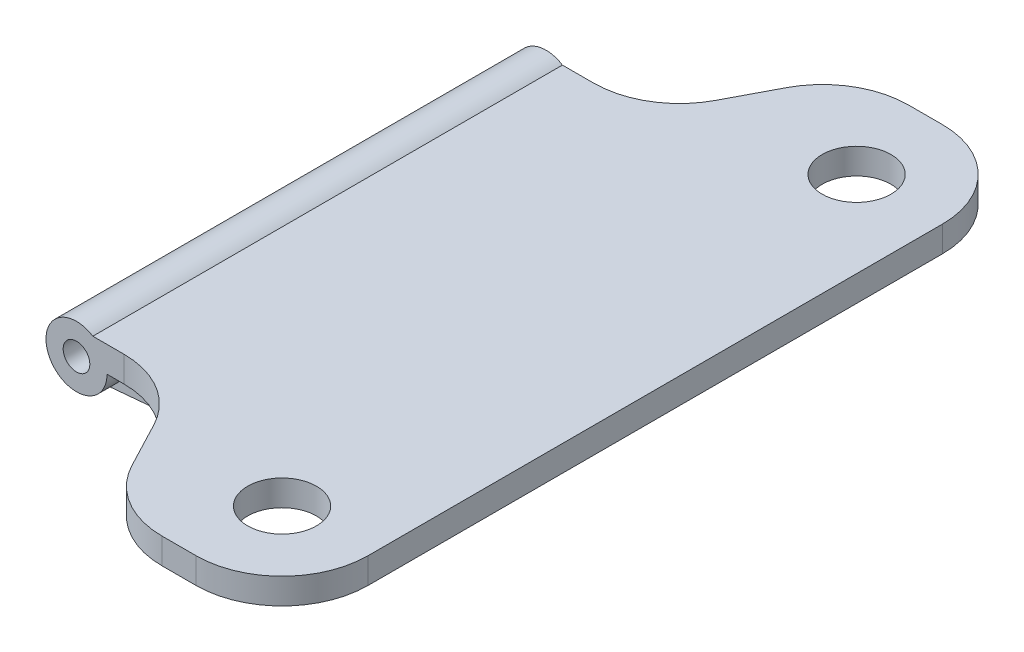
ISO-10303-21;
HEADER;
FILE_DESCRIPTION(('STEP AP214'),'2;1');
FILE_NAME('part.step','',(''),(''),'','','');
FILE_SCHEMA(('AUTOMOTIVE_DESIGN { 1 0 10303 214 1 1 1 1 }'));
ENDSEC;
DATA;
#1=APPLICATION_CONTEXT('core data for automotive mechanical design processes');
#2=APPLICATION_PROTOCOL_DEFINITION('international standard','automotive_design',2000,#1);
#3=PRODUCT_CONTEXT('',#1,'mechanical');
#4=PRODUCT('Part','Part','',(#3));
#5=PRODUCT_RELATED_PRODUCT_CATEGORY('part','',(#4));
#6=PRODUCT_DEFINITION_FORMATION('','',#4);
#7=PRODUCT_DEFINITION_CONTEXT('part definition',#1,'design');
#8=PRODUCT_DEFINITION('design','',#6,#7);
#9=PRODUCT_DEFINITION_SHAPE('','',#8);
#10=(LENGTH_UNIT() NAMED_UNIT(*) SI_UNIT(.MILLI.,.METRE.));
#11=(NAMED_UNIT(*) PLANE_ANGLE_UNIT() SI_UNIT($,.RADIAN.));
#12=(NAMED_UNIT(*) SI_UNIT($,.STERADIAN.) SOLID_ANGLE_UNIT());
#13=UNCERTAINTY_MEASURE_WITH_UNIT(LENGTH_MEASURE(1.E-05),#10,'distance_accuracy_value','');
#14=(GEOMETRIC_REPRESENTATION_CONTEXT(3) GLOBAL_UNCERTAINTY_ASSIGNED_CONTEXT((#13)) GLOBAL_UNIT_ASSIGNED_CONTEXT((#10,
#11,#12)) REPRESENTATION_CONTEXT('',''));
#15=CARTESIAN_POINT('',(0.,0.,0.));
#16=DIRECTION('',(0.,0.,1.));
#17=DIRECTION('',(1.,0.,0.));
#18=AXIS2_PLACEMENT_3D('',#15,#16,#17);
#19=CARTESIAN_POINT('',(38.1,0.,-42.418));
#20=DIRECTION('',(0.,-1.,0.));
#21=DIRECTION('',(0.,0.,-1.));
#22=AXIS2_PLACEMENT_3D('',#19,#20,#21);
#23=PLANE('',#22);
#24=CARTESIAN_POINT('',(38.1,0.,-42.418));
#25=DIRECTION('',(0.,1.,0.));
#26=DIRECTION('',(0.,0.,1.));
#27=AXIS2_PLACEMENT_3D('',#24,#25,#26);
#28=CIRCLE('',#27,5.08000000000001);
#29=CARTESIAN_POINT('',(38.1,0.,-37.338));
#30=VERTEX_POINT('',#29);
#31=EDGE_CURVE('E531',#30,#30,#28,.T.);
#32=ORIENTED_EDGE('',*,*,#31,.T.);
#33=EDGE_LOOP('',(#32));
#34=FACE_BOUND('',#33,.T.);
#35=DIRECTION('',(0.,0.,-1.));
#36=VECTOR('',#35,1.);
#37=CARTESIAN_POINT('',(50.8,0.,42.4179999999999));
#38=LINE('',#37,#36);
#39=CARTESIAN_POINT('',(50.8,0.,-31.75));
#40=VERTEX_POINT('',#39);
#41=CARTESIAN_POINT('',(50.8,0.,-42.4179999999999));
#42=VERTEX_POINT('',#41);
#43=EDGE_CURVE('E184',#40,#42,#38,.T.);
#44=ORIENTED_EDGE('',*,*,#43,.F.);
#45=DIRECTION('',(1.,0.,0.));
#46=VECTOR('',#45,1.);
#47=CARTESIAN_POINT('',(4.05605473335851,0.,-31.75));
#48=LINE('',#47,#46);
#49=CARTESIAN_POINT('',(4.5085,0.,-31.75));
#50=VERTEX_POINT('',#49);
#51=EDGE_CURVE('E545',#50,#40,#48,.T.);
#52=ORIENTED_EDGE('',*,*,#51,.F.);
#53=DIRECTION('',(0.,0.,1.));
#54=VECTOR('',#53,1.);
#55=CARTESIAN_POINT('',(4.5085,0.,-34.671));
#56=LINE('',#55,#54);
#57=CARTESIAN_POINT('',(4.5085,0.,-34.671));
#58=VERTEX_POINT('',#57);
#59=EDGE_CURVE('E228',#50,#58,#56,.F.);
#60=ORIENTED_EDGE('',*,*,#59,.T.);
#61=DIRECTION('',(-1.,0.,0.));
#62=VECTOR('',#61,1.);
#63=CARTESIAN_POINT('',(1.9685,0.,-34.671));
#64=LINE('',#63,#62);
#65=CARTESIAN_POINT('',(6.99111113202102,0.,-34.671));
#66=VERTEX_POINT('',#65);
#67=EDGE_CURVE('E464',#66,#58,#64,.T.);
#68=ORIENTED_EDGE('',*,*,#67,.F.);
#69=CARTESIAN_POINT('',(6.99111113202108,0.,-47.371));
#70=DIRECTION('',(0.,-1.,0.));
#71=DIRECTION('',(0.,0.,1.));
#72=AXIS2_PLACEMENT_3D('',#69,#70,#71);
#73=CIRCLE('',#72,12.7);
#74=CARTESIAN_POINT('',(18.2363830696182,0.,-41.4689783930003));
#75=VERTEX_POINT('',#74);
#76=EDGE_CURVE('E497',#75,#66,#73,.T.);
#77=ORIENTED_EDGE('',*,*,#76,.F.);
#78=DIRECTION('',(-0.464726110787379,0.,0.885454483275361));
#79=VECTOR('',#78,1.);
#80=CARTESIAN_POINT('',(18.2363830696182,0.,-41.4689783930003));
#81=LINE('',#80,#79);
#82=CARTESIAN_POINT('',(21.8321169303818,0.,-48.3200216069997));
#83=VERTEX_POINT('',#82);
#84=EDGE_CURVE('E495',#83,#75,#81,.T.);
#85=ORIENTED_EDGE('',*,*,#84,.F.);
#86=CARTESIAN_POINT('',(33.0773888679789,0.,-42.418));
#87=DIRECTION('',(0.,1.,0.));
#88=DIRECTION('',(0.,0.,-1.));
#89=AXIS2_PLACEMENT_3D('',#86,#87,#88);
#90=CIRCLE('',#89,12.7);
#91=CARTESIAN_POINT('',(33.077388867979,0.,-55.118));
#92=VERTEX_POINT('',#91);
#93=EDGE_CURVE('E493',#92,#83,#90,.T.);
#94=ORIENTED_EDGE('',*,*,#93,.F.);
#95=DIRECTION('',(-1.,0.,0.));
#96=VECTOR('',#95,1.);
#97=CARTESIAN_POINT('',(33.077388867979,0.,-55.118));
#98=LINE('',#97,#96);
#99=CARTESIAN_POINT('',(38.0999999999999,0.,-55.118));
#100=VERTEX_POINT('',#99);
#101=EDGE_CURVE('E490',#100,#92,#98,.T.);
#102=ORIENTED_EDGE('',*,*,#101,.F.);
#103=CARTESIAN_POINT('',(38.1,0.,-42.418));
#104=DIRECTION('',(0.,1.,0.));
#105=DIRECTION('',(0.,0.,-1.));
#106=AXIS2_PLACEMENT_3D('',#103,#104,#105);
#107=CIRCLE('',#106,12.7);
#108=EDGE_CURVE('E488',#42,#100,#107,.T.);
#109=ORIENTED_EDGE('',*,*,#108,.F.);
#110=EDGE_LOOP('',(#44,#52,#60,#68,#77,#85,#94,#102,#109));
#111=FACE_BOUND('',#110,.T.);
#112=ADVANCED_FACE('F32',(#34,#111),#23,.T.);
#113=CARTESIAN_POINT('',(0.,0.,-34.671));
#114=DIRECTION('',(0.,0.,1.));
#115=DIRECTION('',(1.,0.,0.));
#116=AXIS2_PLACEMENT_3D('',#113,#114,#115);
#117=CYLINDRICAL_SURFACE('',#116,4.5085);
#118=CARTESIAN_POINT('',(0.,0.,31.75));
#119=DIRECTION('',(0.,0.,1.));
#120=DIRECTION('',(1.,0.,0.));
#121=AXIS2_PLACEMENT_3D('',#118,#119,#120);
#122=CIRCLE('',#121,4.5085);
#123=CARTESIAN_POINT('',(4.5085,0.,31.75));
#124=VERTEX_POINT('',#123);
#125=CARTESIAN_POINT('',(0.794004722180393,-4.4380320809065,31.75));
#126=VERTEX_POINT('',#125);
#127=EDGE_CURVE('E166',#124,#126,#122,.F.);
#128=ORIENTED_EDGE('',*,*,#127,.F.);
#129=CARTESIAN_POINT('',(4.5085,0.,34.671));
#130=VERTEX_POINT('',#129);
#131=EDGE_CURVE('E176',#130,#124,#56,.F.);
#132=ORIENTED_EDGE('',*,*,#131,.F.);
#133=CARTESIAN_POINT('',(0.,0.,34.671));
#134=DIRECTION('',(0.,0.,1.));
#135=DIRECTION('',(1.,0.,0.));
#136=AXIS2_PLACEMENT_3D('',#133,#134,#135);
#137=CIRCLE('',#136,4.5085);
#138=CARTESIAN_POINT('',(2.41049211780499,3.81,34.671));
#139=VERTEX_POINT('',#138);
#140=EDGE_CURVE('E236',#139,#130,#137,.T.);
#141=ORIENTED_EDGE('',*,*,#140,.F.);
#142=DIRECTION('',(0.,0.,1.));
#143=VECTOR('',#142,1.);
#144=CARTESIAN_POINT('',(2.41049211780499,3.81,-34.671));
#145=LINE('',#144,#143);
#146=CARTESIAN_POINT('',(2.41049211780499,3.81,-34.671));
#147=VERTEX_POINT('',#146);
#148=EDGE_CURVE('E230',#139,#147,#145,.F.);
#149=ORIENTED_EDGE('',*,*,#148,.T.);
#150=CARTESIAN_POINT('',(0.,0.,-34.671));
#151=DIRECTION('',(0.,0.,1.));
#152=DIRECTION('',(1.,0.,0.));
#153=AXIS2_PLACEMENT_3D('',#150,#151,#152);
#154=CIRCLE('',#153,4.5085);
#155=EDGE_CURVE('E11',#147,#58,#154,.T.);
#156=ORIENTED_EDGE('',*,*,#155,.T.);
#157=ORIENTED_EDGE('',*,*,#59,.F.);
#158=CARTESIAN_POINT('',(0.,0.,-31.75));
#159=DIRECTION('',(0.,0.,1.));
#160=DIRECTION('',(1.,0.,0.));
#161=AXIS2_PLACEMENT_3D('',#158,#159,#160);
#162=CIRCLE('',#161,4.5085);
#163=CARTESIAN_POINT('',(0.794004722180393,-4.4380320809065,-31.75));
#164=VERTEX_POINT('',#163);
#165=EDGE_CURVE('E522',#50,#164,#162,.F.);
#166=ORIENTED_EDGE('',*,*,#165,.T.);
#167=DIRECTION('',(0.,0.,1.));
#168=VECTOR('',#167,1.);
#169=CARTESIAN_POINT('',(0.794004722180401,-4.43803208090649,-34.671));
#170=LINE('',#169,#168);
#171=EDGE_CURVE('E159',#126,#164,#170,.F.);
#172=ORIENTED_EDGE('',*,*,#171,.F.);
#173=EDGE_LOOP('',(#128,#132,#141,#149,#156,#157,#166,#172));
#174=FACE_BOUND('',#173,.T.);
#175=ADVANCED_FACE('F34',(#174),#117,.T.);
#176=CARTESIAN_POINT('',(0.,0.,-34.671));
#177=DIRECTION('',(0.,0.,1.));
#178=DIRECTION('',(1.,0.,0.));
#179=AXIS2_PLACEMENT_3D('',#176,#177,#178);
#180=PLANE('',#179);
#181=ORIENTED_EDGE('',*,*,#155,.F.);
#182=DIRECTION('',(-1.,0.,0.));
#183=VECTOR('',#182,1.);
#184=CARTESIAN_POINT('',(1.9685,3.81,-34.671));
#185=LINE('',#184,#183);
#186=CARTESIAN_POINT('',(6.99111113202102,3.81,-34.671));
#187=VERTEX_POINT('',#186);
#188=EDGE_CURVE('E462',#187,#147,#185,.T.);
#189=ORIENTED_EDGE('',*,*,#188,.F.);
#190=DIRECTION('',(0.,-1.,0.));
#191=VECTOR('',#190,1.);
#192=CARTESIAN_POINT('',(6.99111113202102,3.81,-34.671));
#193=LINE('',#192,#191);
#194=EDGE_CURVE('E213',#187,#66,#193,.T.);
#195=ORIENTED_EDGE('',*,*,#194,.T.);
#196=ORIENTED_EDGE('',*,*,#67,.T.);
#197=EDGE_LOOP('',(#181,#189,#195,#196));
#198=FACE_BOUND('',#197,.T.);
#199=CARTESIAN_POINT('',(0.,0.,-34.671));
#200=DIRECTION('',(0.,0.,1.));
#201=DIRECTION('',(1.,0.,0.));
#202=AXIS2_PLACEMENT_3D('',#199,#200,#201);
#203=CIRCLE('',#202,1.9685);
#204=CARTESIAN_POINT('',(1.9685,0.,-34.671));
#205=VERTEX_POINT('',#204);
#206=EDGE_CURVE('E40',#205,#205,#203,.T.);
#207=ORIENTED_EDGE('',*,*,#206,.T.);
#208=EDGE_LOOP('',(#207));
#209=FACE_BOUND('',#208,.T.);
#210=ADVANCED_FACE('F240',(#198,#209),#180,.F.);
#211=CARTESIAN_POINT('',(0.,0.,-34.671));
#212=DIRECTION('',(0.,0.,1.));
#213=DIRECTION('',(1.,0.,0.));
#214=AXIS2_PLACEMENT_3D('',#211,#212,#213);
#215=CYLINDRICAL_SURFACE('',#214,1.9685);
#216=ORIENTED_EDGE('',*,*,#206,.F.);
#217=EDGE_LOOP('',(#216));
#218=FACE_BOUND('',#217,.T.);
#219=CARTESIAN_POINT('',(0.,0.,34.671));
#220=DIRECTION('',(0.,0.,1.));
#221=DIRECTION('',(1.,0.,0.));
#222=AXIS2_PLACEMENT_3D('',#219,#220,#221);
#223=CIRCLE('',#222,1.9685);
#224=CARTESIAN_POINT('',(1.9685,0.,34.671));
#225=VERTEX_POINT('',#224);
#226=EDGE_CURVE('E233',#225,#225,#223,.T.);
#227=ORIENTED_EDGE('',*,*,#226,.T.);
#228=EDGE_LOOP('',(#227));
#229=FACE_BOUND('',#228,.T.);
#230=ADVANCED_FACE('F242',(#218,#229),#215,.F.);
#231=CARTESIAN_POINT('',(0.,0.,34.671));
#232=DIRECTION('',(0.,0.,1.));
#233=DIRECTION('',(1.,0.,0.));
#234=AXIS2_PLACEMENT_3D('',#231,#232,#233);
#235=PLANE('',#234);
#236=ORIENTED_EDGE('',*,*,#140,.T.);
#237=DIRECTION('',(1.,0.,0.));
#238=VECTOR('',#237,1.);
#239=CARTESIAN_POINT('',(1.9685,0.,34.671));
#240=LINE('',#239,#238);
#241=CARTESIAN_POINT('',(6.99111113202102,0.,34.671));
#242=VERTEX_POINT('',#241);
#243=EDGE_CURVE('E500',#130,#242,#240,.T.);
#244=ORIENTED_EDGE('',*,*,#243,.T.);
#245=DIRECTION('',(0.,-1.,0.));
#246=VECTOR('',#245,1.);
#247=CARTESIAN_POINT('',(6.99111113202102,3.81,34.671));
#248=LINE('',#247,#246);
#249=CARTESIAN_POINT('',(6.99111113202102,3.81,34.671));
#250=VERTEX_POINT('',#249);
#251=EDGE_CURVE('E210',#250,#242,#248,.T.);
#252=ORIENTED_EDGE('',*,*,#251,.F.);
#253=DIRECTION('',(1.,0.,0.));
#254=VECTOR('',#253,1.);
#255=CARTESIAN_POINT('',(1.9685,3.81,34.671));
#256=LINE('',#255,#254);
#257=EDGE_CURVE('E55',#139,#250,#256,.T.);
#258=ORIENTED_EDGE('',*,*,#257,.F.);
#259=EDGE_LOOP('',(#236,#244,#252,#258));
#260=FACE_BOUND('',#259,.T.);
#261=ORIENTED_EDGE('',*,*,#226,.F.);
#262=EDGE_LOOP('',(#261));
#263=FACE_BOUND('',#262,.T.);
#264=ADVANCED_FACE('F245',(#260,#263),#235,.T.);
#265=CARTESIAN_POINT('',(38.1,3.81,-42.418));
#266=DIRECTION('',(0.,-1.,0.));
#267=DIRECTION('',(0.,0.,-1.));
#268=AXIS2_PLACEMENT_3D('',#265,#266,#267);
#269=PLANE('',#268);
#270=ORIENTED_EDGE('',*,*,#148,.F.);
#271=ORIENTED_EDGE('',*,*,#257,.T.);
#272=CARTESIAN_POINT('',(6.99111113202108,3.81,47.371));
#273=DIRECTION('',(0.,-1.,0.));
#274=DIRECTION('',(0.,0.,-1.));
#275=AXIS2_PLACEMENT_3D('',#272,#273,#274);
#276=CIRCLE('',#275,12.7);
#277=CARTESIAN_POINT('',(18.2363830696182,3.81,41.4689783930003));
#278=VERTEX_POINT('',#277);
#279=EDGE_CURVE('E472',#250,#278,#276,.T.);
#280=ORIENTED_EDGE('',*,*,#279,.T.);
#281=DIRECTION('',(0.464726110787379,0.,0.885454483275361));
#282=VECTOR('',#281,1.);
#283=CARTESIAN_POINT('',(18.2363830696182,3.81,41.4689783930003));
#284=LINE('',#283,#282);
#285=CARTESIAN_POINT('',(21.8321169303818,3.81,48.3200216069997));
#286=VERTEX_POINT('',#285);
#287=EDGE_CURVE('E479',#278,#286,#284,.T.);
#288=ORIENTED_EDGE('',*,*,#287,.T.);
#289=CARTESIAN_POINT('',(33.0773888679789,3.81,42.418));
#290=DIRECTION('',(0.,1.,0.));
#291=DIRECTION('',(0.,0.,1.));
#292=AXIS2_PLACEMENT_3D('',#289,#290,#291);
#293=CIRCLE('',#292,12.7);
#294=CARTESIAN_POINT('',(33.0773888679789,3.81,55.118));
#295=VERTEX_POINT('',#294);
#296=EDGE_CURVE('E481',#286,#295,#293,.T.);
#297=ORIENTED_EDGE('',*,*,#296,.T.);
#298=DIRECTION('',(1.,0.,0.));
#299=VECTOR('',#298,1.);
#300=CARTESIAN_POINT('',(33.077388867979,3.81,55.118));
#301=LINE('',#300,#299);
#302=CARTESIAN_POINT('',(38.0999999999999,3.81,55.118));
#303=VERTEX_POINT('',#302);
#304=EDGE_CURVE('E483',#295,#303,#301,.T.);
#305=ORIENTED_EDGE('',*,*,#304,.T.);
#306=CARTESIAN_POINT('',(38.1,3.81,42.418));
#307=DIRECTION('',(0.,1.,0.));
#308=DIRECTION('',(0.,0.,1.));
#309=AXIS2_PLACEMENT_3D('',#306,#307,#308);
#310=CIRCLE('',#309,12.7);
#311=CARTESIAN_POINT('',(50.8,3.81,42.4179999999999));
#312=VERTEX_POINT('',#311);
#313=EDGE_CURVE('E485',#303,#312,#310,.T.);
#314=ORIENTED_EDGE('',*,*,#313,.T.);
#315=DIRECTION('',(0.,0.,-1.));
#316=VECTOR('',#315,1.);
#317=CARTESIAN_POINT('',(50.8,3.81,42.4179999999999));
#318=LINE('',#317,#316);
#319=CARTESIAN_POINT('',(50.8,3.81,-42.4179999999999));
#320=VERTEX_POINT('',#319);
#321=EDGE_CURVE('E196',#312,#320,#318,.T.);
#322=ORIENTED_EDGE('',*,*,#321,.T.);
#323=CARTESIAN_POINT('',(38.1,3.81,-42.418));
#324=DIRECTION('',(0.,1.,0.));
#325=DIRECTION('',(0.,0.,-1.));
#326=AXIS2_PLACEMENT_3D('',#323,#324,#325);
#327=CIRCLE('',#326,12.7);
#328=CARTESIAN_POINT('',(38.0999999999999,3.81,-55.118));
#329=VERTEX_POINT('',#328);
#330=EDGE_CURVE('E183',#320,#329,#327,.T.);
#331=ORIENTED_EDGE('',*,*,#330,.T.);
#332=DIRECTION('',(-1.,0.,0.));
#333=VECTOR('',#332,1.);
#334=CARTESIAN_POINT('',(33.077388867979,3.81,-55.118));
#335=LINE('',#334,#333);
#336=CARTESIAN_POINT('',(33.077388867979,3.81,-55.118));
#337=VERTEX_POINT('',#336);
#338=EDGE_CURVE('E187',#329,#337,#335,.T.);
#339=ORIENTED_EDGE('',*,*,#338,.T.);
#340=CARTESIAN_POINT('',(33.0773888679789,3.81,-42.418));
#341=DIRECTION('',(0.,1.,0.));
#342=DIRECTION('',(0.,0.,-1.));
#343=AXIS2_PLACEMENT_3D('',#340,#341,#342);
#344=CIRCLE('',#343,12.7);
#345=CARTESIAN_POINT('',(21.8321169303818,3.81,-48.3200216069997));
#346=VERTEX_POINT('',#345);
#347=EDGE_CURVE('E536',#337,#346,#344,.T.);
#348=ORIENTED_EDGE('',*,*,#347,.T.);
#349=DIRECTION('',(-0.464726110787379,0.,0.885454483275361));
#350=VECTOR('',#349,1.);
#351=CARTESIAN_POINT('',(18.2363830696182,3.81,-41.4689783930003));
#352=LINE('',#351,#350);
#353=CARTESIAN_POINT('',(18.2363830696182,3.81,-41.4689783930003));
#354=VERTEX_POINT('',#353);
#355=EDGE_CURVE('E474',#346,#354,#352,.T.);
#356=ORIENTED_EDGE('',*,*,#355,.T.);
#357=CARTESIAN_POINT('',(6.99111113202108,3.81,-47.371));
#358=DIRECTION('',(0.,-1.,0.));
#359=DIRECTION('',(0.,0.,1.));
#360=AXIS2_PLACEMENT_3D('',#357,#358,#359);
#361=CIRCLE('',#360,12.7);
#362=EDGE_CURVE('E469',#354,#187,#361,.T.);
#363=ORIENTED_EDGE('',*,*,#362,.T.);
#364=ORIENTED_EDGE('',*,*,#188,.T.);
#365=EDGE_LOOP('',(#270,#271,#280,#288,#297,#305,#314,#322,#331,#339,#348,#356,#363,#364));
#366=FACE_BOUND('',#365,.T.);
#367=CARTESIAN_POINT('',(38.1,3.81,-42.418));
#368=DIRECTION('',(0.,1.,0.));
#369=DIRECTION('',(0.,0.,1.));
#370=AXIS2_PLACEMENT_3D('',#367,#368,#369);
#371=CIRCLE('',#370,5.08000000000001);
#372=CARTESIAN_POINT('',(38.1,3.81,-37.338));
#373=VERTEX_POINT('',#372);
#374=EDGE_CURVE('E491',#373,#373,#371,.T.);
#375=ORIENTED_EDGE('',*,*,#374,.F.);
#376=EDGE_LOOP('',(#375));
#377=FACE_BOUND('',#376,.T.);
#378=CARTESIAN_POINT('',(38.1,3.81,42.418));
#379=DIRECTION('',(0.,1.,0.));
#380=DIRECTION('',(0.,0.,1.));
#381=AXIS2_PLACEMENT_3D('',#378,#379,#380);
#382=CIRCLE('',#381,5.08000000000001);
#383=CARTESIAN_POINT('',(38.1,3.81,47.498));
#384=VERTEX_POINT('',#383);
#385=EDGE_CURVE('E525',#384,#384,#382,.T.);
#386=ORIENTED_EDGE('',*,*,#385,.F.);
#387=EDGE_LOOP('',(#386));
#388=FACE_BOUND('',#387,.T.);
#389=ADVANCED_FACE('F250',(#366,#377,#388),#269,.F.);
#390=DIRECTION('',(1.,0.,0.));
#391=VECTOR('',#390,1.);
#392=CARTESIAN_POINT('',(4.05605473335851,0.,31.75));
#393=LINE('',#392,#391);
#394=CARTESIAN_POINT('',(50.8,0.,31.75));
#395=VERTEX_POINT('',#394);
#396=EDGE_CURVE('E164',#124,#395,#393,.T.);
#397=ORIENTED_EDGE('',*,*,#396,.T.);
#398=CARTESIAN_POINT('',(50.8,0.,42.4179999999999));
#399=VERTEX_POINT('',#398);
#400=EDGE_CURVE('E174',#399,#395,#38,.T.);
#401=ORIENTED_EDGE('',*,*,#400,.F.);
#402=CARTESIAN_POINT('',(38.1,0.,42.418));
#403=DIRECTION('',(0.,1.,0.));
#404=DIRECTION('',(0.,0.,1.));
#405=AXIS2_PLACEMENT_3D('',#402,#403,#404);
#406=CIRCLE('',#405,12.7);
#407=CARTESIAN_POINT('',(38.0999999999999,0.,55.118));
#408=VERTEX_POINT('',#407);
#409=EDGE_CURVE('E189',#408,#399,#406,.T.);
#410=ORIENTED_EDGE('',*,*,#409,.F.);
#411=DIRECTION('',(1.,0.,0.));
#412=VECTOR('',#411,1.);
#413=CARTESIAN_POINT('',(33.077388867979,0.,55.118));
#414=LINE('',#413,#412);
#415=CARTESIAN_POINT('',(33.0773888679789,0.,55.118));
#416=VERTEX_POINT('',#415);
#417=EDGE_CURVE('E507',#416,#408,#414,.T.);
#418=ORIENTED_EDGE('',*,*,#417,.F.);
#419=CARTESIAN_POINT('',(33.0773888679789,0.,42.418));
#420=DIRECTION('',(0.,1.,0.));
#421=DIRECTION('',(0.,0.,1.));
#422=AXIS2_PLACEMENT_3D('',#419,#420,#421);
#423=CIRCLE('',#422,12.7);
#424=CARTESIAN_POINT('',(21.8321169303818,0.,48.3200216069997));
#425=VERTEX_POINT('',#424);
#426=EDGE_CURVE('E506',#425,#416,#423,.T.);
#427=ORIENTED_EDGE('',*,*,#426,.F.);
#428=DIRECTION('',(0.464726110787379,0.,0.885454483275361));
#429=VECTOR('',#428,1.);
#430=CARTESIAN_POINT('',(18.2363830696182,0.,41.4689783930003));
#431=LINE('',#430,#429);
#432=CARTESIAN_POINT('',(18.2363830696182,0.,41.4689783930003));
#433=VERTEX_POINT('',#432);
#434=EDGE_CURVE('E504',#433,#425,#431,.T.);
#435=ORIENTED_EDGE('',*,*,#434,.F.);
#436=CARTESIAN_POINT('',(6.99111113202108,0.,47.371));
#437=DIRECTION('',(0.,-1.,0.));
#438=DIRECTION('',(0.,0.,-1.));
#439=AXIS2_PLACEMENT_3D('',#436,#437,#438);
#440=CIRCLE('',#439,12.7);
#441=EDGE_CURVE('E502',#242,#433,#440,.T.);
#442=ORIENTED_EDGE('',*,*,#441,.F.);
#443=ORIENTED_EDGE('',*,*,#243,.F.);
#444=ORIENTED_EDGE('',*,*,#131,.T.);
#445=EDGE_LOOP('',(#397,#401,#410,#418,#427,#435,#442,#443,#444));
#446=FACE_BOUND('',#445,.T.);
#447=CARTESIAN_POINT('',(38.1,0.,42.418));
#448=DIRECTION('',(0.,1.,0.));
#449=DIRECTION('',(0.,0.,1.));
#450=AXIS2_PLACEMENT_3D('',#447,#448,#449);
#451=CIRCLE('',#450,5.08000000000001);
#452=CARTESIAN_POINT('',(38.1,0.,47.498));
#453=VERTEX_POINT('',#452);
#454=EDGE_CURVE('E521',#453,#453,#451,.T.);
#455=ORIENTED_EDGE('',*,*,#454,.T.);
#456=EDGE_LOOP('',(#455));
#457=FACE_BOUND('',#456,.T.);
#458=ADVANCED_FACE('F171',(#446,#457),#23,.T.);
#459=CARTESIAN_POINT('',(38.1,3.81,-42.418));
#460=DIRECTION('',(0.,-1.,0.));
#461=DIRECTION('',(0.,0.,-1.));
#462=AXIS2_PLACEMENT_3D('',#459,#460,#461);
#463=CYLINDRICAL_SURFACE('',#462,12.7);
#464=ORIENTED_EDGE('',*,*,#108,.T.);
#465=DIRECTION('',(0.,-1.,0.));
#466=VECTOR('',#465,1.);
#467=CARTESIAN_POINT('',(38.0999999999999,3.81,-55.118));
#468=LINE('',#467,#466);
#469=EDGE_CURVE('E225',#329,#100,#468,.T.);
#470=ORIENTED_EDGE('',*,*,#469,.F.);
#471=ORIENTED_EDGE('',*,*,#330,.F.);
#472=DIRECTION('',(0.,-1.,0.));
#473=VECTOR('',#472,1.);
#474=CARTESIAN_POINT('',(50.8,3.81,-42.4179999999999));
#475=LINE('',#474,#473);
#476=EDGE_CURVE('E193',#320,#42,#475,.T.);
#477=ORIENTED_EDGE('',*,*,#476,.T.);
#478=EDGE_LOOP('',(#464,#470,#471,#477));
#479=FACE_BOUND('',#478,.T.);
#480=ADVANCED_FACE('F269',(#479),#463,.T.);
#481=CARTESIAN_POINT('',(33.077388867979,3.81,-55.118));
#482=DIRECTION('',(0.,0.,1.));
#483=DIRECTION('',(1.,0.,0.));
#484=AXIS2_PLACEMENT_3D('',#481,#482,#483);
#485=PLANE('',#484);
#486=ORIENTED_EDGE('',*,*,#101,.T.);
#487=DIRECTION('',(0.,-1.,0.));
#488=VECTOR('',#487,1.);
#489=CARTESIAN_POINT('',(33.077388867979,3.81,-55.118));
#490=LINE('',#489,#488);
#491=EDGE_CURVE('E222',#337,#92,#490,.T.);
#492=ORIENTED_EDGE('',*,*,#491,.F.);
#493=ORIENTED_EDGE('',*,*,#338,.F.);
#494=ORIENTED_EDGE('',*,*,#469,.T.);
#495=EDGE_LOOP('',(#486,#492,#493,#494));
#496=FACE_BOUND('',#495,.T.);
#497=ADVANCED_FACE('F273',(#496),#485,.F.);
#498=CARTESIAN_POINT('',(33.0773888679789,3.81,-42.418));
#499=DIRECTION('',(0.,-1.,0.));
#500=DIRECTION('',(0.,0.,-1.));
#501=AXIS2_PLACEMENT_3D('',#498,#499,#500);
#502=CYLINDRICAL_SURFACE('',#501,12.7);
#503=ORIENTED_EDGE('',*,*,#93,.T.);
#504=DIRECTION('',(0.,-1.,0.));
#505=VECTOR('',#504,1.);
#506=CARTESIAN_POINT('',(21.8321169303818,3.81,-48.3200216069997));
#507=LINE('',#506,#505);
#508=EDGE_CURVE('E219',#346,#83,#507,.T.);
#509=ORIENTED_EDGE('',*,*,#508,.F.);
#510=ORIENTED_EDGE('',*,*,#347,.F.);
#511=ORIENTED_EDGE('',*,*,#491,.T.);
#512=EDGE_LOOP('',(#503,#509,#510,#511));
#513=FACE_BOUND('',#512,.T.);
#514=ADVANCED_FACE('F278',(#513),#502,.T.);
#515=CARTESIAN_POINT('',(18.2363830696182,3.81,-41.4689783930003));
#516=DIRECTION('',(0.885454483275361,0.,0.464726110787379));
#517=DIRECTION('',(0.464726110787379,0.,-0.885454483275361));
#518=AXIS2_PLACEMENT_3D('',#515,#516,#517);
#519=PLANE('',#518);
#520=ORIENTED_EDGE('',*,*,#84,.T.);
#521=DIRECTION('',(0.,-1.,0.));
#522=VECTOR('',#521,1.);
#523=CARTESIAN_POINT('',(18.2363830696182,3.81,-41.4689783930003));
#524=LINE('',#523,#522);
#525=EDGE_CURVE('E216',#354,#75,#524,.T.);
#526=ORIENTED_EDGE('',*,*,#525,.F.);
#527=ORIENTED_EDGE('',*,*,#355,.F.);
#528=ORIENTED_EDGE('',*,*,#508,.T.);
#529=EDGE_LOOP('',(#520,#526,#527,#528));
#530=FACE_BOUND('',#529,.T.);
#531=ADVANCED_FACE('F285',(#530),#519,.F.);
#532=CARTESIAN_POINT('',(6.99111113202108,3.81,-47.371));
#533=DIRECTION('',(0.,-1.,0.));
#534=DIRECTION('',(0.,0.,-1.));
#535=AXIS2_PLACEMENT_3D('',#532,#533,#534);
#536=CYLINDRICAL_SURFACE('',#535,12.7);
#537=ORIENTED_EDGE('',*,*,#76,.T.);
#538=ORIENTED_EDGE('',*,*,#194,.F.);
#539=ORIENTED_EDGE('',*,*,#362,.F.);
#540=ORIENTED_EDGE('',*,*,#525,.T.);
#541=EDGE_LOOP('',(#537,#538,#539,#540));
#542=FACE_BOUND('',#541,.T.);
#543=ADVANCED_FACE('F289',(#542),#536,.F.);
#544=CARTESIAN_POINT('',(6.99111113202108,3.81,47.371));
#545=DIRECTION('',(0.,-1.,0.));
#546=DIRECTION('',(0.,0.,-1.));
#547=AXIS2_PLACEMENT_3D('',#544,#545,#546);
#548=CYLINDRICAL_SURFACE('',#547,12.7);
#549=ORIENTED_EDGE('',*,*,#441,.T.);
#550=DIRECTION('',(0.,-1.,0.));
#551=VECTOR('',#550,1.);
#552=CARTESIAN_POINT('',(18.2363830696182,3.81,41.4689783930003));
#553=LINE('',#552,#551);
#554=EDGE_CURVE('E207',#278,#433,#553,.T.);
#555=ORIENTED_EDGE('',*,*,#554,.F.);
#556=ORIENTED_EDGE('',*,*,#279,.F.);
#557=ORIENTED_EDGE('',*,*,#251,.T.);
#558=EDGE_LOOP('',(#549,#555,#556,#557));
#559=FACE_BOUND('',#558,.T.);
#560=ADVANCED_FACE('F293',(#559),#548,.F.);
#561=CARTESIAN_POINT('',(18.2363830696182,3.81,41.4689783930003));
#562=DIRECTION('',(0.885454483275361,0.,-0.464726110787379));
#563=DIRECTION('',(-0.464726110787379,0.,-0.885454483275361));
#564=AXIS2_PLACEMENT_3D('',#561,#562,#563);
#565=PLANE('',#564);
#566=ORIENTED_EDGE('',*,*,#434,.T.);
#567=DIRECTION('',(0.,-1.,0.));
#568=VECTOR('',#567,1.);
#569=CARTESIAN_POINT('',(21.8321169303818,3.81,48.3200216069997));
#570=LINE('',#569,#568);
#571=EDGE_CURVE('E204',#286,#425,#570,.T.);
#572=ORIENTED_EDGE('',*,*,#571,.F.);
#573=ORIENTED_EDGE('',*,*,#287,.F.);
#574=ORIENTED_EDGE('',*,*,#554,.T.);
#575=EDGE_LOOP('',(#566,#572,#573,#574));
#576=FACE_BOUND('',#575,.T.);
#577=ADVANCED_FACE('F297',(#576),#565,.F.);
#578=CARTESIAN_POINT('',(33.0773888679789,3.81,42.418));
#579=DIRECTION('',(0.,-1.,0.));
#580=DIRECTION('',(0.,0.,-1.));
#581=AXIS2_PLACEMENT_3D('',#578,#579,#580);
#582=CYLINDRICAL_SURFACE('',#581,12.7);
#583=ORIENTED_EDGE('',*,*,#426,.T.);
#584=DIRECTION('',(0.,-1.,0.));
#585=VECTOR('',#584,1.);
#586=CARTESIAN_POINT('',(33.0773888679789,3.81,55.118));
#587=LINE('',#586,#585);
#588=EDGE_CURVE('E201',#295,#416,#587,.T.);
#589=ORIENTED_EDGE('',*,*,#588,.F.);
#590=ORIENTED_EDGE('',*,*,#296,.F.);
#591=ORIENTED_EDGE('',*,*,#571,.T.);
#592=EDGE_LOOP('',(#583,#589,#590,#591));
#593=FACE_BOUND('',#592,.T.);
#594=ADVANCED_FACE('F301',(#593),#582,.T.);
#595=CARTESIAN_POINT('',(33.077388867979,3.81,55.118));
#596=DIRECTION('',(0.,0.,-1.));
#597=DIRECTION('',(-1.,0.,0.));
#598=AXIS2_PLACEMENT_3D('',#595,#596,#597);
#599=PLANE('',#598);
#600=ORIENTED_EDGE('',*,*,#417,.T.);
#601=DIRECTION('',(0.,-1.,0.));
#602=VECTOR('',#601,1.);
#603=CARTESIAN_POINT('',(38.0999999999999,3.81,55.118));
#604=LINE('',#603,#602);
#605=EDGE_CURVE('E198',#303,#408,#604,.T.);
#606=ORIENTED_EDGE('',*,*,#605,.F.);
#607=ORIENTED_EDGE('',*,*,#304,.F.);
#608=ORIENTED_EDGE('',*,*,#588,.T.);
#609=EDGE_LOOP('',(#600,#606,#607,#608));
#610=FACE_BOUND('',#609,.T.);
#611=ADVANCED_FACE('F305',(#610),#599,.F.);
#612=CARTESIAN_POINT('',(38.1,3.81,42.418));
#613=DIRECTION('',(0.,-1.,0.));
#614=DIRECTION('',(0.,0.,-1.));
#615=AXIS2_PLACEMENT_3D('',#612,#613,#614);
#616=CYLINDRICAL_SURFACE('',#615,12.7);
#617=ORIENTED_EDGE('',*,*,#409,.T.);
#618=DIRECTION('',(0.,-1.,0.));
#619=VECTOR('',#618,1.);
#620=CARTESIAN_POINT('',(50.8,3.81,42.4179999999999));
#621=LINE('',#620,#619);
#622=EDGE_CURVE('E182',#312,#399,#621,.T.);
#623=ORIENTED_EDGE('',*,*,#622,.F.);
#624=ORIENTED_EDGE('',*,*,#313,.F.);
#625=ORIENTED_EDGE('',*,*,#605,.T.);
#626=EDGE_LOOP('',(#617,#623,#624,#625));
#627=FACE_BOUND('',#626,.T.);
#628=ADVANCED_FACE('F309',(#627),#616,.T.);
#629=CARTESIAN_POINT('',(50.8,3.81,42.4179999999999));
#630=DIRECTION('',(-1.,0.,0.));
#631=DIRECTION('',(0.,0.,1.));
#632=AXIS2_PLACEMENT_3D('',#629,#630,#631);
#633=PLANE('',#632);
#634=ORIENTED_EDGE('',*,*,#400,.T.);
#635=DIRECTION('',(0.,0.,-1.));
#636=VECTOR('',#635,1.);
#637=CARTESIAN_POINT('',(50.8,0.,31.75));
#638=LINE('',#637,#636);
#639=EDGE_CURVE('E152',#395,#40,#638,.T.);
#640=ORIENTED_EDGE('',*,*,#639,.T.);
#641=ORIENTED_EDGE('',*,*,#43,.T.);
#642=ORIENTED_EDGE('',*,*,#476,.F.);
#643=ORIENTED_EDGE('',*,*,#321,.F.);
#644=ORIENTED_EDGE('',*,*,#622,.T.);
#645=EDGE_LOOP('',(#634,#640,#641,#642,#643,#644));
#646=FACE_BOUND('',#645,.T.);
#647=ADVANCED_FACE('F179',(#646),#633,.F.);
#648=CARTESIAN_POINT('',(38.1,3.81,-42.418));
#649=DIRECTION('',(0.,-1.,0.));
#650=DIRECTION('',(0.,0.,-1.));
#651=AXIS2_PLACEMENT_3D('',#648,#649,#650);
#652=CYLINDRICAL_SURFACE('',#651,5.08000000000001);
#653=ORIENTED_EDGE('',*,*,#374,.T.);
#654=EDGE_LOOP('',(#653));
#655=FACE_BOUND('',#654,.T.);
#656=ORIENTED_EDGE('',*,*,#31,.F.);
#657=EDGE_LOOP('',(#656));
#658=FACE_BOUND('',#657,.T.);
#659=ADVANCED_FACE('F314',(#655,#658),#652,.F.);
#660=CARTESIAN_POINT('',(38.1,3.81,42.418));
#661=DIRECTION('',(0.,-1.,0.));
#662=DIRECTION('',(0.,0.,-1.));
#663=AXIS2_PLACEMENT_3D('',#660,#661,#662);
#664=CYLINDRICAL_SURFACE('',#663,5.08000000000001);
#665=ORIENTED_EDGE('',*,*,#385,.T.);
#666=EDGE_LOOP('',(#665));
#667=FACE_BOUND('',#666,.T.);
#668=ORIENTED_EDGE('',*,*,#454,.F.);
#669=EDGE_LOOP('',(#668));
#670=FACE_BOUND('',#669,.T.);
#671=ADVANCED_FACE('F318',(#667,#670),#664,.F.);
#672=CARTESIAN_POINT('',(50.8,0.,31.75));
#673=DIRECTION('',(0.0884025288556572,-0.996084832176419,0.));
#674=DIRECTION('',(0.996084832176419,0.0884025288556573,0.));
#675=AXIS2_PLACEMENT_3D('',#672,#673,#674);
#676=PLANE('',#675);
#677=DIRECTION('',(-0.996084832176419,-0.0884025288556573,0.));
#678=VECTOR('',#677,1.);
#679=CARTESIAN_POINT('',(50.8,0.,31.75));
#680=LINE('',#679,#678);
#681=EDGE_CURVE('E155',#395,#126,#680,.T.);
#682=ORIENTED_EDGE('',*,*,#681,.T.);
#683=ORIENTED_EDGE('',*,*,#171,.T.);
#684=DIRECTION('',(-0.996084832176419,-0.0884025288556573,0.));
#685=VECTOR('',#684,1.);
#686=CARTESIAN_POINT('',(50.8,0.,-31.75));
#687=LINE('',#686,#685);
#688=EDGE_CURVE('E47',#40,#164,#687,.T.);
#689=ORIENTED_EDGE('',*,*,#688,.F.);
#690=ORIENTED_EDGE('',*,*,#639,.F.);
#691=EDGE_LOOP('',(#682,#683,#689,#690));
#692=FACE_BOUND('',#691,.T.);
#693=ADVANCED_FACE('F154',(#692),#676,.T.);
#694=CARTESIAN_POINT('',(0.,0.,31.75));
#695=DIRECTION('',(0.,0.,1.));
#696=DIRECTION('',(1.,0.,0.));
#697=AXIS2_PLACEMENT_3D('',#694,#695,#696);
#698=PLANE('',#697);
#699=ORIENTED_EDGE('',*,*,#396,.F.);
#700=ORIENTED_EDGE('',*,*,#127,.T.);
#701=ORIENTED_EDGE('',*,*,#681,.F.);
#702=EDGE_LOOP('',(#699,#700,#701));
#703=FACE_BOUND('',#702,.T.);
#704=ADVANCED_FACE('F163',(#703),#698,.T.);
#705=CARTESIAN_POINT('',(0.,0.,-31.75));
#706=DIRECTION('',(0.,0.,1.));
#707=DIRECTION('',(1.,0.,0.));
#708=AXIS2_PLACEMENT_3D('',#705,#706,#707);
#709=PLANE('',#708);
#710=ORIENTED_EDGE('',*,*,#165,.F.);
#711=ORIENTED_EDGE('',*,*,#51,.T.);
#712=ORIENTED_EDGE('',*,*,#688,.T.);
#713=EDGE_LOOP('',(#710,#711,#712));
#714=FACE_BOUND('',#713,.T.);
#715=ADVANCED_FACE('F331',(#714),#709,.F.);
#716=CLOSED_SHELL('',(#112,#175,#210,#230,#264,#389,#458,#480,#497,#514,#531,#543,#560,#577,
#594,#611,#628,#647,#659,#671,#693,#704,#715));
#717=MANIFOLD_SOLID_BREP('B2',#716);
#718=ADVANCED_BREP_SHAPE_REPRESENTATION('',(#18,#717),#14);
#719=SHAPE_DEFINITION_REPRESENTATION(#9,#718);
ENDSEC;
END-ISO-10303-21;
